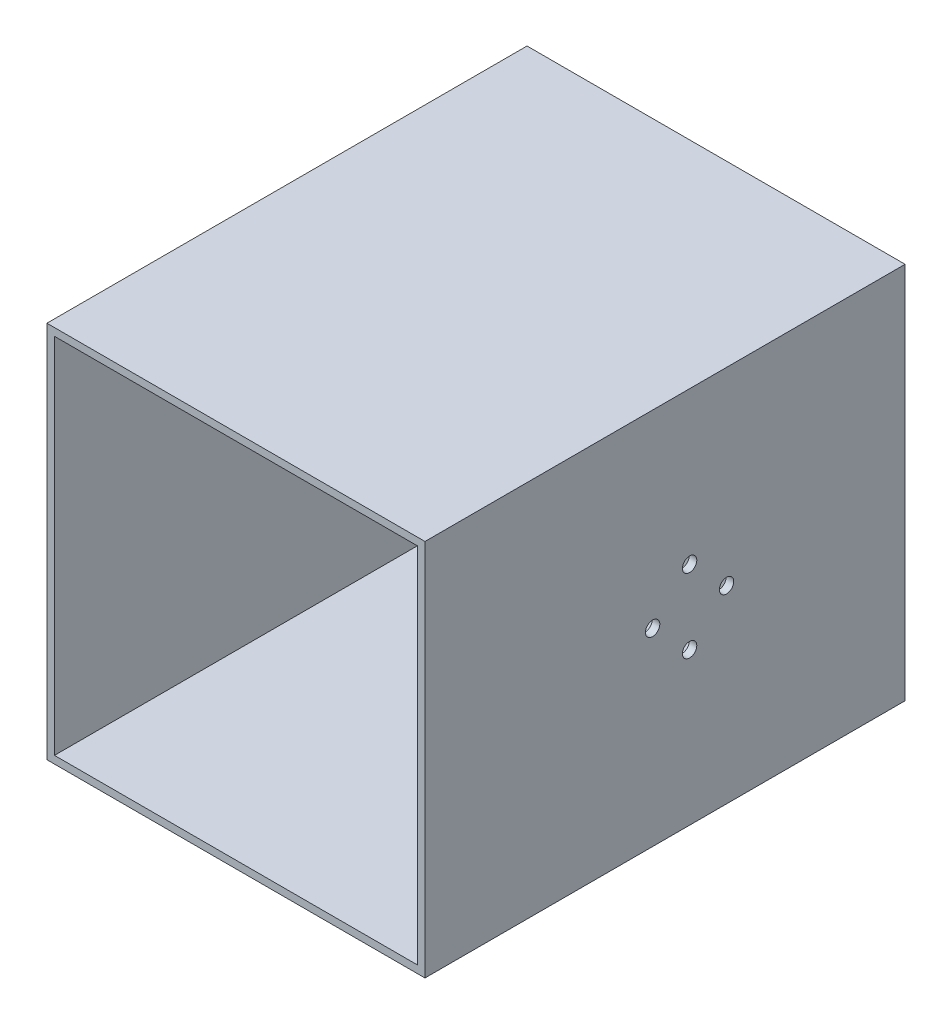
ISO-10303-21;
HEADER;
FILE_DESCRIPTION(('STEP AP214'),'2;1');
FILE_NAME('part.step','',(''),(''),'','','');
FILE_SCHEMA(('AUTOMOTIVE_DESIGN { 1 0 10303 214 1 1 1 1 }'));
ENDSEC;
DATA;
#1=APPLICATION_CONTEXT('core data for automotive mechanical design processes');
#2=APPLICATION_PROTOCOL_DEFINITION('international standard','automotive_design',2000,#1);
#3=PRODUCT_CONTEXT('',#1,'mechanical');
#4=PRODUCT('Part','Part','',(#3));
#5=PRODUCT_RELATED_PRODUCT_CATEGORY('part','',(#4));
#6=PRODUCT_DEFINITION_FORMATION('','',#4);
#7=PRODUCT_DEFINITION_CONTEXT('part definition',#1,'design');
#8=PRODUCT_DEFINITION('design','',#6,#7);
#9=PRODUCT_DEFINITION_SHAPE('','',#8);
#10=(LENGTH_UNIT() NAMED_UNIT(*) SI_UNIT(.MILLI.,.METRE.));
#11=(NAMED_UNIT(*) PLANE_ANGLE_UNIT() SI_UNIT($,.RADIAN.));
#12=(NAMED_UNIT(*) SI_UNIT($,.STERADIAN.) SOLID_ANGLE_UNIT());
#13=UNCERTAINTY_MEASURE_WITH_UNIT(LENGTH_MEASURE(1.E-05),#10,'distance_accuracy_value','');
#14=(GEOMETRIC_REPRESENTATION_CONTEXT(3) GLOBAL_UNCERTAINTY_ASSIGNED_CONTEXT((#13)) GLOBAL_UNIT_ASSIGNED_CONTEXT((#10,
#11,#12)) REPRESENTATION_CONTEXT('',''));
#15=CARTESIAN_POINT('',(0.,0.,0.));
#16=DIRECTION('',(0.,0.,1.));
#17=DIRECTION('',(1.,0.,0.));
#18=AXIS2_PLACEMENT_3D('',#15,#16,#17);
#19=CARTESIAN_POINT('',(69.248829913772,9.5730774637267,2.));
#20=DIRECTION('',(1.,0.,0.));
#21=DIRECTION('',(0.,0.,-1.));
#22=AXIS2_PLACEMENT_3D('',#19,#20,#21);
#23=PLANE('',#22);
#24=CARTESIAN_POINT('',(69.248829913772,69.3520774637267,57.));
#25=DIRECTION('',(1.,0.,0.));
#26=DIRECTION('',(0.,0.,-1.));
#27=AXIS2_PLACEMENT_3D('',#24,#25,#26);
#28=CIRCLE('',#27,1.9);
#29=CARTESIAN_POINT('',(69.248829913772,69.3520774637267,55.1));
#30=VERTEX_POINT('',#29);
#31=EDGE_CURVE('E169',#30,#30,#28,.T.);
#32=ORIENTED_EDGE('',*,*,#31,.T.);
#33=EDGE_LOOP('',(#32));
#34=FACE_BOUND('',#33,.T.);
#35=CARTESIAN_POINT('',(69.248829913772,59.5730774637268,47.2209999999999));
#36=DIRECTION('',(1.,0.,0.));
#37=DIRECTION('',(0.,0.,-1.));
#38=AXIS2_PLACEMENT_3D('',#35,#36,#37);
#39=CIRCLE('',#38,1.9);
#40=CARTESIAN_POINT('',(69.248829913772,59.5730774637268,45.3209999999999));
#41=VERTEX_POINT('',#40);
#42=EDGE_CURVE('E235',#41,#41,#39,.T.);
#43=ORIENTED_EDGE('',*,*,#42,.T.);
#44=EDGE_LOOP('',(#43));
#45=FACE_BOUND('',#44,.T.);
#46=CARTESIAN_POINT('',(69.248829913772,49.7940774637267,56.9999999999998));
#47=DIRECTION('',(1.,0.,0.));
#48=DIRECTION('',(0.,0.,-1.));
#49=AXIS2_PLACEMENT_3D('',#46,#47,#48);
#50=CIRCLE('',#49,1.9);
#51=CARTESIAN_POINT('',(69.248829913772,49.7940774637267,55.0999999999998));
#52=VERTEX_POINT('',#51);
#53=EDGE_CURVE('E239',#52,#52,#50,.T.);
#54=ORIENTED_EDGE('',*,*,#53,.T.);
#55=EDGE_LOOP('',(#54));
#56=FACE_BOUND('',#55,.T.);
#57=CARTESIAN_POINT('',(69.248829913772,59.5730774637267,66.7789999999999));
#58=DIRECTION('',(1.,0.,0.));
#59=DIRECTION('',(0.,0.,-1.));
#60=AXIS2_PLACEMENT_3D('',#57,#58,#59);
#61=CIRCLE('',#60,1.9);
#62=CARTESIAN_POINT('',(69.248829913772,59.5730774637267,64.8789999999998));
#63=VERTEX_POINT('',#62);
#64=EDGE_CURVE('E243',#63,#63,#61,.T.);
#65=ORIENTED_EDGE('',*,*,#64,.T.);
#66=EDGE_LOOP('',(#65));
#67=FACE_BOUND('',#66,.T.);
#68=DIRECTION('',(0.,-1.,0.));
#69=VECTOR('',#68,1.);
#70=CARTESIAN_POINT('',(69.248829913772,9.5730774637267,0.));
#71=LINE('',#70,#69);
#72=CARTESIAN_POINT('',(69.248829913772,109.573077463727,0.));
#73=VERTEX_POINT('',#72);
#74=CARTESIAN_POINT('',(69.248829913772,9.5730774637267,0.));
#75=VERTEX_POINT('',#74);
#76=EDGE_CURVE('E148',#73,#75,#71,.T.);
#77=ORIENTED_EDGE('',*,*,#76,.T.);
#78=DIRECTION('',(0.,0.,-1.));
#79=VECTOR('',#78,1.);
#80=CARTESIAN_POINT('',(69.248829913772,9.5730774637267,2.));
#81=LINE('',#80,#79);
#82=CARTESIAN_POINT('',(69.248829913772,9.5730774637267,127.));
#83=VERTEX_POINT('',#82);
#84=EDGE_CURVE('E11',#83,#75,#81,.T.);
#85=ORIENTED_EDGE('',*,*,#84,.F.);
#86=DIRECTION('',(0.,-1.,0.));
#87=VECTOR('',#86,1.);
#88=CARTESIAN_POINT('',(69.248829913772,109.573077463727,127.));
#89=LINE('',#88,#87);
#90=CARTESIAN_POINT('',(69.248829913772,109.573077463727,127.));
#91=VERTEX_POINT('',#90);
#92=EDGE_CURVE('E142',#91,#83,#89,.T.);
#93=ORIENTED_EDGE('',*,*,#92,.F.);
#94=DIRECTION('',(0.,0.,-1.));
#95=VECTOR('',#94,1.);
#96=CARTESIAN_POINT('',(69.248829913772,109.573077463727,2.));
#97=LINE('',#96,#95);
#98=EDGE_CURVE('E157',#91,#73,#97,.T.);
#99=ORIENTED_EDGE('',*,*,#98,.T.);
#100=EDGE_LOOP('',(#77,#85,#93,#99));
#101=FACE_BOUND('',#100,.T.);
#102=ADVANCED_FACE('F33',(#34,#45,#56,#67,#101),#23,.F.);
#103=CARTESIAN_POINT('',(169.248829913772,9.57307746372671,2.));
#104=DIRECTION('',(0.,1.,0.));
#105=DIRECTION('',(-1.,0.,0.));
#106=AXIS2_PLACEMENT_3D('',#103,#104,#105);
#107=PLANE('',#106);
#108=DIRECTION('',(1.,0.,0.));
#109=VECTOR('',#108,1.);
#110=CARTESIAN_POINT('',(169.248829913772,9.57307746372671,0.));
#111=LINE('',#110,#109);
#112=CARTESIAN_POINT('',(169.248829913772,9.57307746372671,0.));
#113=VERTEX_POINT('',#112);
#114=EDGE_CURVE('E151',#75,#113,#111,.T.);
#115=ORIENTED_EDGE('',*,*,#114,.T.);
#116=DIRECTION('',(0.,0.,-1.));
#117=VECTOR('',#116,1.);
#118=CARTESIAN_POINT('',(169.248829913772,9.57307746372671,2.));
#119=LINE('',#118,#117);
#120=CARTESIAN_POINT('',(169.248829913772,9.5730774637267,127.));
#121=VERTEX_POINT('',#120);
#122=EDGE_CURVE('E41',#121,#113,#119,.T.);
#123=ORIENTED_EDGE('',*,*,#122,.F.);
#124=DIRECTION('',(1.,0.,0.));
#125=VECTOR('',#124,1.);
#126=CARTESIAN_POINT('',(169.248829913772,9.5730774637267,127.));
#127=LINE('',#126,#125);
#128=EDGE_CURVE('E145',#83,#121,#127,.T.);
#129=ORIENTED_EDGE('',*,*,#128,.F.);
#130=ORIENTED_EDGE('',*,*,#84,.T.);
#131=EDGE_LOOP('',(#115,#123,#129,#130));
#132=FACE_BOUND('',#131,.T.);
#133=ADVANCED_FACE('F223',(#132),#107,.F.);
#134=CARTESIAN_POINT('',(169.248829913772,9.57307746372671,2.));
#135=DIRECTION('',(-1.,0.,0.));
#136=DIRECTION('',(0.,0.,1.));
#137=AXIS2_PLACEMENT_3D('',#134,#135,#136);
#138=PLANE('',#137);
#139=CARTESIAN_POINT('',(169.248829913772,69.3520774637267,57.));
#140=DIRECTION('',(-1.,0.,0.));
#141=DIRECTION('',(0.,0.,1.));
#142=AXIS2_PLACEMENT_3D('',#139,#140,#141);
#143=CIRCLE('',#142,1.9);
#144=CARTESIAN_POINT('',(169.248829913772,69.3520774637267,58.9));
#145=VERTEX_POINT('',#144);
#146=EDGE_CURVE('E127',#145,#145,#143,.T.);
#147=ORIENTED_EDGE('',*,*,#146,.T.);
#148=EDGE_LOOP('',(#147));
#149=FACE_BOUND('',#148,.T.);
#150=CARTESIAN_POINT('',(169.248829913772,59.5730774637268,47.2209999999999));
#151=DIRECTION('',(-1.,0.,0.));
#152=DIRECTION('',(0.,0.,1.));
#153=AXIS2_PLACEMENT_3D('',#150,#151,#152);
#154=CIRCLE('',#153,1.9);
#155=CARTESIAN_POINT('',(169.248829913772,59.5730774637268,49.1209999999999));
#156=VERTEX_POINT('',#155);
#157=EDGE_CURVE('E181',#156,#156,#154,.T.);
#158=ORIENTED_EDGE('',*,*,#157,.T.);
#159=EDGE_LOOP('',(#158));
#160=FACE_BOUND('',#159,.T.);
#161=CARTESIAN_POINT('',(169.248829913772,49.7940774637267,56.9999999999998));
#162=DIRECTION('',(-1.,0.,0.));
#163=DIRECTION('',(0.,0.,1.));
#164=AXIS2_PLACEMENT_3D('',#161,#162,#163);
#165=CIRCLE('',#164,1.9);
#166=CARTESIAN_POINT('',(169.248829913772,49.7940774637267,58.8999999999998));
#167=VERTEX_POINT('',#166);
#168=EDGE_CURVE('E177',#167,#167,#165,.T.);
#169=ORIENTED_EDGE('',*,*,#168,.T.);
#170=EDGE_LOOP('',(#169));
#171=FACE_BOUND('',#170,.T.);
#172=CARTESIAN_POINT('',(169.248829913772,59.5730774637267,66.7789999999999));
#173=DIRECTION('',(-1.,0.,0.));
#174=DIRECTION('',(0.,0.,1.));
#175=AXIS2_PLACEMENT_3D('',#172,#173,#174);
#176=CIRCLE('',#175,1.9);
#177=CARTESIAN_POINT('',(169.248829913772,59.5730774637267,68.6789999999998));
#178=VERTEX_POINT('',#177);
#179=EDGE_CURVE('E173',#178,#178,#176,.T.);
#180=ORIENTED_EDGE('',*,*,#179,.T.);
#181=EDGE_LOOP('',(#180));
#182=FACE_BOUND('',#181,.T.);
#183=DIRECTION('',(0.,1.,0.));
#184=VECTOR('',#183,1.);
#185=CARTESIAN_POINT('',(169.248829913772,9.57307746372671,0.));
#186=LINE('',#185,#184);
#187=CARTESIAN_POINT('',(169.248829913772,109.573077463727,0.));
#188=VERTEX_POINT('',#187);
#189=EDGE_CURVE('E153',#113,#188,#186,.T.);
#190=ORIENTED_EDGE('',*,*,#189,.T.);
#191=DIRECTION('',(0.,0.,-1.));
#192=VECTOR('',#191,1.);
#193=CARTESIAN_POINT('',(169.248829913772,109.573077463727,2.));
#194=LINE('',#193,#192);
#195=CARTESIAN_POINT('',(169.248829913772,109.573077463727,127.));
#196=VERTEX_POINT('',#195);
#197=EDGE_CURVE('E160',#196,#188,#194,.T.);
#198=ORIENTED_EDGE('',*,*,#197,.F.);
#199=DIRECTION('',(0.,1.,0.));
#200=VECTOR('',#199,1.);
#201=CARTESIAN_POINT('',(169.248829913772,109.573077463727,127.));
#202=LINE('',#201,#200);
#203=EDGE_CURVE('E113',#121,#196,#202,.T.);
#204=ORIENTED_EDGE('',*,*,#203,.F.);
#205=ORIENTED_EDGE('',*,*,#122,.T.);
#206=EDGE_LOOP('',(#190,#198,#204,#205));
#207=FACE_BOUND('',#206,.T.);
#208=ADVANCED_FACE('F198',(#149,#160,#171,#182,#207),#138,.F.);
#209=CARTESIAN_POINT('',(169.248829913772,109.573077463727,2.));
#210=DIRECTION('',(0.,-1.,0.));
#211=DIRECTION('',(1.,0.,0.));
#212=AXIS2_PLACEMENT_3D('',#209,#210,#211);
#213=PLANE('',#212);
#214=DIRECTION('',(-1.,0.,0.));
#215=VECTOR('',#214,1.);
#216=CARTESIAN_POINT('',(169.248829913772,109.573077463727,0.));
#217=LINE('',#216,#215);
#218=EDGE_CURVE('E155',#188,#73,#217,.T.);
#219=ORIENTED_EDGE('',*,*,#218,.T.);
#220=ORIENTED_EDGE('',*,*,#98,.F.);
#221=DIRECTION('',(-1.,0.,0.));
#222=VECTOR('',#221,1.);
#223=CARTESIAN_POINT('',(169.248829913772,109.573077463727,127.));
#224=LINE('',#223,#222);
#225=EDGE_CURVE('E139',#196,#91,#224,.T.);
#226=ORIENTED_EDGE('',*,*,#225,.F.);
#227=ORIENTED_EDGE('',*,*,#197,.T.);
#228=EDGE_LOOP('',(#219,#220,#226,#227));
#229=FACE_BOUND('',#228,.T.);
#230=ADVANCED_FACE('F256',(#229),#213,.F.);
#231=CARTESIAN_POINT('',(0.,0.,0.));
#232=DIRECTION('',(0.,0.,1.));
#233=DIRECTION('',(1.,0.,0.));
#234=AXIS2_PLACEMENT_3D('',#231,#232,#233);
#235=PLANE('',#234);
#236=ORIENTED_EDGE('',*,*,#76,.F.);
#237=ORIENTED_EDGE('',*,*,#218,.F.);
#238=ORIENTED_EDGE('',*,*,#189,.F.);
#239=ORIENTED_EDGE('',*,*,#114,.F.);
#240=EDGE_LOOP('',(#236,#237,#238,#239));
#241=FACE_BOUND('',#240,.T.);
#242=ADVANCED_FACE('F248',(#241),#235,.F.);
#243=CARTESIAN_POINT('',(0.,0.,127.));
#244=DIRECTION('',(0.,0.,-1.));
#245=DIRECTION('',(-1.,0.,0.));
#246=AXIS2_PLACEMENT_3D('',#243,#244,#245);
#247=PLANE('',#246);
#248=ORIENTED_EDGE('',*,*,#203,.T.);
#249=ORIENTED_EDGE('',*,*,#225,.T.);
#250=ORIENTED_EDGE('',*,*,#92,.T.);
#251=ORIENTED_EDGE('',*,*,#128,.T.);
#252=EDGE_LOOP('',(#248,#249,#250,#251));
#253=FACE_BOUND('',#252,.T.);
#254=DIRECTION('',(0.,-1.,0.));
#255=VECTOR('',#254,1.);
#256=CARTESIAN_POINT('',(71.248829913772,107.573077463727,127.));
#257=LINE('',#256,#255);
#258=CARTESIAN_POINT('',(71.248829913772,107.573077463727,127.));
#259=VERTEX_POINT('',#258);
#260=CARTESIAN_POINT('',(71.248829913772,11.5730774637267,127.));
#261=VERTEX_POINT('',#260);
#262=EDGE_CURVE('E98',#259,#261,#257,.T.);
#263=ORIENTED_EDGE('',*,*,#262,.F.);
#264=DIRECTION('',(-1.,0.,0.));
#265=VECTOR('',#264,1.);
#266=CARTESIAN_POINT('',(71.248829913772,107.573077463727,127.));
#267=LINE('',#266,#265);
#268=CARTESIAN_POINT('',(167.248829913772,107.573077463727,127.));
#269=VERTEX_POINT('',#268);
#270=EDGE_CURVE('E121',#269,#259,#267,.T.);
#271=ORIENTED_EDGE('',*,*,#270,.F.);
#272=DIRECTION('',(0.,1.,0.));
#273=VECTOR('',#272,1.);
#274=CARTESIAN_POINT('',(167.248829913772,107.573077463727,127.));
#275=LINE('',#274,#273);
#276=CARTESIAN_POINT('',(167.248829913772,11.5730774637267,127.));
#277=VERTEX_POINT('',#276);
#278=EDGE_CURVE('E119',#277,#269,#275,.T.);
#279=ORIENTED_EDGE('',*,*,#278,.F.);
#280=DIRECTION('',(1.,0.,0.));
#281=VECTOR('',#280,1.);
#282=CARTESIAN_POINT('',(71.248829913772,11.5730774637267,127.));
#283=LINE('',#282,#281);
#284=EDGE_CURVE('E107',#261,#277,#283,.T.);
#285=ORIENTED_EDGE('',*,*,#284,.F.);
#286=EDGE_LOOP('',(#263,#271,#279,#285));
#287=FACE_BOUND('',#286,.T.);
#288=ADVANCED_FACE('F117',(#253,#287),#247,.F.);
#289=CARTESIAN_POINT('',(71.248829913772,107.573077463727,127.));
#290=DIRECTION('',(1.,0.,0.));
#291=DIRECTION('',(0.,1.,0.));
#292=AXIS2_PLACEMENT_3D('',#289,#290,#291);
#293=PLANE('',#292);
#294=CARTESIAN_POINT('',(71.248829913772,69.3520774637267,57.));
#295=DIRECTION('',(1.,0.,0.));
#296=DIRECTION('',(0.,1.,0.));
#297=AXIS2_PLACEMENT_3D('',#294,#295,#296);
#298=CIRCLE('',#297,1.9);
#299=CARTESIAN_POINT('',(71.248829913772,71.2520774637267,57.));
#300=VERTEX_POINT('',#299);
#301=EDGE_CURVE('E193',#300,#300,#298,.T.);
#302=ORIENTED_EDGE('',*,*,#301,.F.);
#303=EDGE_LOOP('',(#302));
#304=FACE_BOUND('',#303,.T.);
#305=CARTESIAN_POINT('',(71.248829913772,59.5730774637268,47.2209999999999));
#306=DIRECTION('',(1.,0.,0.));
#307=DIRECTION('',(0.,1.,0.));
#308=AXIS2_PLACEMENT_3D('',#305,#306,#307);
#309=CIRCLE('',#308,1.9);
#310=CARTESIAN_POINT('',(71.248829913772,61.4730774637268,47.2209999999999));
#311=VERTEX_POINT('',#310);
#312=EDGE_CURVE('E176',#311,#311,#309,.T.);
#313=ORIENTED_EDGE('',*,*,#312,.F.);
#314=EDGE_LOOP('',(#313));
#315=FACE_BOUND('',#314,.T.);
#316=CARTESIAN_POINT('',(71.248829913772,49.7940774637267,56.9999999999998));
#317=DIRECTION('',(1.,0.,0.));
#318=DIRECTION('',(0.,1.,0.));
#319=AXIS2_PLACEMENT_3D('',#316,#317,#318);
#320=CIRCLE('',#319,1.9);
#321=CARTESIAN_POINT('',(71.248829913772,51.6940774637267,56.9999999999998));
#322=VERTEX_POINT('',#321);
#323=EDGE_CURVE('E172',#322,#322,#320,.T.);
#324=ORIENTED_EDGE('',*,*,#323,.F.);
#325=EDGE_LOOP('',(#324));
#326=FACE_BOUND('',#325,.T.);
#327=CARTESIAN_POINT('',(71.248829913772,59.5730774637267,66.7789999999999));
#328=DIRECTION('',(1.,0.,0.));
#329=DIRECTION('',(0.,1.,0.));
#330=AXIS2_PLACEMENT_3D('',#327,#328,#329);
#331=CIRCLE('',#330,1.9);
#332=CARTESIAN_POINT('',(71.248829913772,61.4730774637267,66.7789999999999));
#333=VERTEX_POINT('',#332);
#334=EDGE_CURVE('E168',#333,#333,#331,.T.);
#335=ORIENTED_EDGE('',*,*,#334,.F.);
#336=EDGE_LOOP('',(#335));
#337=FACE_BOUND('',#336,.T.);
#338=DIRECTION('',(0.,-1.,0.));
#339=VECTOR('',#338,1.);
#340=CARTESIAN_POINT('',(71.248829913772,107.573077463727,2.));
#341=LINE('',#340,#339);
#342=CARTESIAN_POINT('',(71.248829913772,107.573077463727,2.));
#343=VERTEX_POINT('',#342);
#344=CARTESIAN_POINT('',(71.248829913772,11.5730774637267,2.));
#345=VERTEX_POINT('',#344);
#346=EDGE_CURVE('E49',#343,#345,#341,.T.);
#347=ORIENTED_EDGE('',*,*,#346,.F.);
#348=DIRECTION('',(0.,0.,-1.));
#349=VECTOR('',#348,1.);
#350=CARTESIAN_POINT('',(71.248829913772,107.573077463727,127.));
#351=LINE('',#350,#349);
#352=EDGE_CURVE('E103',#259,#343,#351,.T.);
#353=ORIENTED_EDGE('',*,*,#352,.F.);
#354=ORIENTED_EDGE('',*,*,#262,.T.);
#355=DIRECTION('',(0.,0.,-1.));
#356=VECTOR('',#355,1.);
#357=CARTESIAN_POINT('',(71.248829913772,11.5730774637267,127.));
#358=LINE('',#357,#356);
#359=EDGE_CURVE('E101',#261,#345,#358,.T.);
#360=ORIENTED_EDGE('',*,*,#359,.T.);
#361=EDGE_LOOP('',(#347,#353,#354,#360));
#362=FACE_BOUND('',#361,.T.);
#363=ADVANCED_FACE('F100',(#304,#315,#326,#337,#362),#293,.T.);
#364=CARTESIAN_POINT('',(71.248829913772,11.5730774637267,127.));
#365=DIRECTION('',(0.,1.,0.));
#366=DIRECTION('',(-1.,0.,0.));
#367=AXIS2_PLACEMENT_3D('',#364,#365,#366);
#368=PLANE('',#367);
#369=DIRECTION('',(1.,0.,0.));
#370=VECTOR('',#369,1.);
#371=CARTESIAN_POINT('',(71.248829913772,11.5730774637267,2.));
#372=LINE('',#371,#370);
#373=CARTESIAN_POINT('',(167.248829913772,11.5730774637267,2.));
#374=VERTEX_POINT('',#373);
#375=EDGE_CURVE('E53',#345,#374,#372,.T.);
#376=ORIENTED_EDGE('',*,*,#375,.F.);
#377=ORIENTED_EDGE('',*,*,#359,.F.);
#378=ORIENTED_EDGE('',*,*,#284,.T.);
#379=DIRECTION('',(0.,0.,-1.));
#380=VECTOR('',#379,1.);
#381=CARTESIAN_POINT('',(167.248829913772,11.5730774637267,127.));
#382=LINE('',#381,#380);
#383=EDGE_CURVE('E114',#277,#374,#382,.T.);
#384=ORIENTED_EDGE('',*,*,#383,.T.);
#385=EDGE_LOOP('',(#376,#377,#378,#384));
#386=FACE_BOUND('',#385,.T.);
#387=ADVANCED_FACE('F111',(#386),#368,.T.);
#388=CARTESIAN_POINT('',(167.248829913772,107.573077463727,127.));
#389=DIRECTION('',(-1.,0.,0.));
#390=DIRECTION('',(0.,-1.,0.));
#391=AXIS2_PLACEMENT_3D('',#388,#389,#390);
#392=PLANE('',#391);
#393=CARTESIAN_POINT('',(167.248829913772,69.3520774637267,57.));
#394=DIRECTION('',(-1.,0.,0.));
#395=DIRECTION('',(0.,-1.,0.));
#396=AXIS2_PLACEMENT_3D('',#393,#394,#395);
#397=CIRCLE('',#396,1.9);
#398=CARTESIAN_POINT('',(167.248829913772,67.4520774637267,57.));
#399=VERTEX_POINT('',#398);
#400=EDGE_CURVE('E36',#399,#399,#397,.T.);
#401=ORIENTED_EDGE('',*,*,#400,.F.);
#402=EDGE_LOOP('',(#401));
#403=FACE_BOUND('',#402,.T.);
#404=CARTESIAN_POINT('',(167.248829913772,59.5730774637268,47.2209999999999));
#405=DIRECTION('',(-1.,0.,0.));
#406=DIRECTION('',(0.,-1.,0.));
#407=AXIS2_PLACEMENT_3D('',#404,#405,#406);
#408=CIRCLE('',#407,1.9);
#409=CARTESIAN_POINT('',(167.248829913772,57.6730774637268,47.2209999999999));
#410=VERTEX_POINT('',#409);
#411=EDGE_CURVE('E174',#410,#410,#408,.T.);
#412=ORIENTED_EDGE('',*,*,#411,.F.);
#413=EDGE_LOOP('',(#412));
#414=FACE_BOUND('',#413,.T.);
#415=CARTESIAN_POINT('',(167.248829913772,49.7940774637267,56.9999999999998));
#416=DIRECTION('',(-1.,0.,0.));
#417=DIRECTION('',(0.,-1.,0.));
#418=AXIS2_PLACEMENT_3D('',#415,#416,#417);
#419=CIRCLE('',#418,1.9);
#420=CARTESIAN_POINT('',(167.248829913772,47.8940774637267,56.9999999999998));
#421=VERTEX_POINT('',#420);
#422=EDGE_CURVE('E170',#421,#421,#419,.T.);
#423=ORIENTED_EDGE('',*,*,#422,.F.);
#424=EDGE_LOOP('',(#423));
#425=FACE_BOUND('',#424,.T.);
#426=CARTESIAN_POINT('',(167.248829913772,59.5730774637267,66.7789999999999));
#427=DIRECTION('',(-1.,0.,0.));
#428=DIRECTION('',(0.,-1.,0.));
#429=AXIS2_PLACEMENT_3D('',#426,#427,#428);
#430=CIRCLE('',#429,1.9);
#431=CARTESIAN_POINT('',(167.248829913772,57.6730774637267,66.7789999999999));
#432=VERTEX_POINT('',#431);
#433=EDGE_CURVE('E165',#432,#432,#430,.T.);
#434=ORIENTED_EDGE('',*,*,#433,.F.);
#435=EDGE_LOOP('',(#434));
#436=FACE_BOUND('',#435,.T.);
#437=DIRECTION('',(0.,1.,0.));
#438=VECTOR('',#437,1.);
#439=CARTESIAN_POINT('',(167.248829913772,107.573077463727,2.));
#440=LINE('',#439,#438);
#441=CARTESIAN_POINT('',(167.248829913772,107.573077463727,2.));
#442=VERTEX_POINT('',#441);
#443=EDGE_CURVE('E129',#374,#442,#440,.T.);
#444=ORIENTED_EDGE('',*,*,#443,.F.);
#445=ORIENTED_EDGE('',*,*,#383,.F.);
#446=ORIENTED_EDGE('',*,*,#278,.T.);
#447=DIRECTION('',(0.,0.,-1.));
#448=VECTOR('',#447,1.);
#449=CARTESIAN_POINT('',(167.248829913772,107.573077463727,127.));
#450=LINE('',#449,#448);
#451=EDGE_CURVE('E133',#269,#442,#450,.T.);
#452=ORIENTED_EDGE('',*,*,#451,.T.);
#453=EDGE_LOOP('',(#444,#445,#446,#452));
#454=FACE_BOUND('',#453,.T.);
#455=ADVANCED_FACE('F277',(#403,#414,#425,#436,#454),#392,.T.);
#456=CARTESIAN_POINT('',(71.248829913772,107.573077463727,127.));
#457=DIRECTION('',(0.,-1.,0.));
#458=DIRECTION('',(0.,0.,-1.));
#459=AXIS2_PLACEMENT_3D('',#456,#457,#458);
#460=PLANE('',#459);
#461=DIRECTION('',(-1.,0.,0.));
#462=VECTOR('',#461,1.);
#463=CARTESIAN_POINT('',(71.248829913772,107.573077463727,2.));
#464=LINE('',#463,#462);
#465=EDGE_CURVE('E108',#442,#343,#464,.T.);
#466=ORIENTED_EDGE('',*,*,#465,.F.);
#467=ORIENTED_EDGE('',*,*,#451,.F.);
#468=ORIENTED_EDGE('',*,*,#270,.T.);
#469=ORIENTED_EDGE('',*,*,#352,.T.);
#470=EDGE_LOOP('',(#466,#467,#468,#469));
#471=FACE_BOUND('',#470,.T.);
#472=ADVANCED_FACE('F269',(#471),#460,.T.);
#473=CARTESIAN_POINT('',(0.,0.,2.));
#474=DIRECTION('',(0.,0.,1.));
#475=DIRECTION('',(1.,0.,0.));
#476=AXIS2_PLACEMENT_3D('',#473,#474,#475);
#477=PLANE('',#476);
#478=ORIENTED_EDGE('',*,*,#346,.T.);
#479=ORIENTED_EDGE('',*,*,#375,.T.);
#480=ORIENTED_EDGE('',*,*,#443,.T.);
#481=ORIENTED_EDGE('',*,*,#465,.T.);
#482=EDGE_LOOP('',(#478,#479,#480,#481));
#483=FACE_BOUND('',#482,.T.);
#484=ADVANCED_FACE('F266',(#483),#477,.T.);
#485=CARTESIAN_POINT('',(69.248829913772,59.5730774637267,66.7789999999999));
#486=DIRECTION('',(1.,0.,0.));
#487=DIRECTION('',(0.,0.,-1.));
#488=AXIS2_PLACEMENT_3D('',#485,#486,#487);
#489=CYLINDRICAL_SURFACE('',#488,1.9);
#490=ORIENTED_EDGE('',*,*,#433,.T.);
#491=EDGE_LOOP('',(#490));
#492=FACE_BOUND('',#491,.T.);
#493=ORIENTED_EDGE('',*,*,#179,.F.);
#494=EDGE_LOOP('',(#493));
#495=FACE_BOUND('',#494,.T.);
#496=ADVANCED_FACE('F215',(#492,#495),#489,.F.);
#497=CARTESIAN_POINT('',(69.248829913772,49.7940774637267,56.9999999999998));
#498=DIRECTION('',(1.,0.,0.));
#499=DIRECTION('',(0.,0.,-1.));
#500=AXIS2_PLACEMENT_3D('',#497,#498,#499);
#501=CYLINDRICAL_SURFACE('',#500,1.9);
#502=ORIENTED_EDGE('',*,*,#422,.T.);
#503=EDGE_LOOP('',(#502));
#504=FACE_BOUND('',#503,.T.);
#505=ORIENTED_EDGE('',*,*,#168,.F.);
#506=EDGE_LOOP('',(#505));
#507=FACE_BOUND('',#506,.T.);
#508=ADVANCED_FACE('F216',(#504,#507),#501,.F.);
#509=CARTESIAN_POINT('',(69.248829913772,59.5730774637268,47.2209999999999));
#510=DIRECTION('',(1.,0.,0.));
#511=DIRECTION('',(0.,0.,-1.));
#512=AXIS2_PLACEMENT_3D('',#509,#510,#511);
#513=CYLINDRICAL_SURFACE('',#512,1.9);
#514=ORIENTED_EDGE('',*,*,#411,.T.);
#515=EDGE_LOOP('',(#514));
#516=FACE_BOUND('',#515,.T.);
#517=ORIENTED_EDGE('',*,*,#157,.F.);
#518=EDGE_LOOP('',(#517));
#519=FACE_BOUND('',#518,.T.);
#520=ADVANCED_FACE('F204',(#516,#519),#513,.F.);
#521=CARTESIAN_POINT('',(69.248829913772,69.3520774637267,57.));
#522=DIRECTION('',(1.,0.,0.));
#523=DIRECTION('',(0.,0.,-1.));
#524=AXIS2_PLACEMENT_3D('',#521,#522,#523);
#525=CYLINDRICAL_SURFACE('',#524,1.9);
#526=ORIENTED_EDGE('',*,*,#400,.T.);
#527=EDGE_LOOP('',(#526));
#528=FACE_BOUND('',#527,.T.);
#529=ORIENTED_EDGE('',*,*,#146,.F.);
#530=EDGE_LOOP('',(#529));
#531=FACE_BOUND('',#530,.T.);
#532=ADVANCED_FACE('F201',(#528,#531),#525,.F.);
#533=ORIENTED_EDGE('',*,*,#334,.T.);
#534=EDGE_LOOP('',(#533));
#535=FACE_BOUND('',#534,.T.);
#536=ORIENTED_EDGE('',*,*,#64,.F.);
#537=EDGE_LOOP('',(#536));
#538=FACE_BOUND('',#537,.T.);
#539=ADVANCED_FACE('F203',(#535,#538),#489,.F.);
#540=ORIENTED_EDGE('',*,*,#323,.T.);
#541=EDGE_LOOP('',(#540));
#542=FACE_BOUND('',#541,.T.);
#543=ORIENTED_EDGE('',*,*,#53,.F.);
#544=EDGE_LOOP('',(#543));
#545=FACE_BOUND('',#544,.T.);
#546=ADVANCED_FACE('F212',(#542,#545),#501,.F.);
#547=ORIENTED_EDGE('',*,*,#312,.T.);
#548=EDGE_LOOP('',(#547));
#549=FACE_BOUND('',#548,.T.);
#550=ORIENTED_EDGE('',*,*,#42,.F.);
#551=EDGE_LOOP('',(#550));
#552=FACE_BOUND('',#551,.T.);
#553=ADVANCED_FACE('F218',(#549,#552),#513,.F.);
#554=ORIENTED_EDGE('',*,*,#301,.T.);
#555=EDGE_LOOP('',(#554));
#556=FACE_BOUND('',#555,.T.);
#557=ORIENTED_EDGE('',*,*,#31,.F.);
#558=EDGE_LOOP('',(#557));
#559=FACE_BOUND('',#558,.T.);
#560=ADVANCED_FACE('F207',(#556,#559),#525,.F.);
#561=CLOSED_SHELL('',(#102,#133,#208,#230,#242,#288,#363,#387,#455,#472,#484,#496,#508,#520,
#532,#539,#546,#553,#560));
#562=MANIFOLD_SOLID_BREP('B2',#561);
#563=ADVANCED_BREP_SHAPE_REPRESENTATION('',(#18,#562),#14);
#564=SHAPE_DEFINITION_REPRESENTATION(#9,#563);
ENDSEC;
END-ISO-10303-21;
